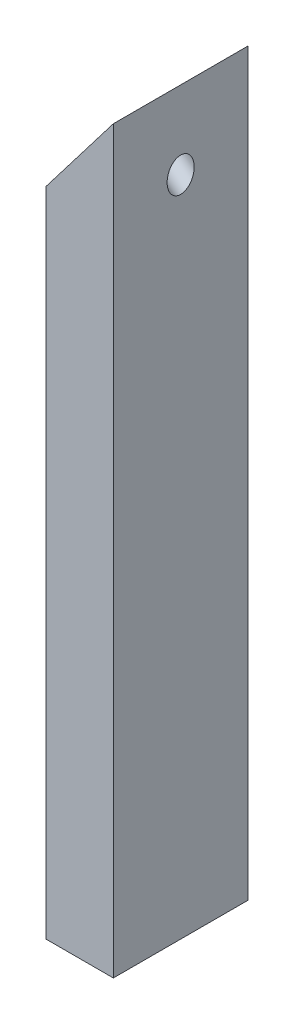
ISO-10303-21;
HEADER;
FILE_DESCRIPTION(('STEP AP214'),'2;1');
FILE_NAME('part.step','',(''),(''),'','','');
FILE_SCHEMA(('AUTOMOTIVE_DESIGN { 1 0 10303 214 1 1 1 1 }'));
ENDSEC;
DATA;
#1=APPLICATION_CONTEXT('core data for automotive mechanical design processes');
#2=APPLICATION_PROTOCOL_DEFINITION('international standard','automotive_design',2000,#1);
#3=PRODUCT_CONTEXT('',#1,'mechanical');
#4=PRODUCT('Part','Part','',(#3));
#5=PRODUCT_RELATED_PRODUCT_CATEGORY('part','',(#4));
#6=PRODUCT_DEFINITION_FORMATION('','',#4);
#7=PRODUCT_DEFINITION_CONTEXT('part definition',#1,'design');
#8=PRODUCT_DEFINITION('design','',#6,#7);
#9=PRODUCT_DEFINITION_SHAPE('','',#8);
#10=(LENGTH_UNIT() NAMED_UNIT(*) SI_UNIT(.MILLI.,.METRE.));
#11=(NAMED_UNIT(*) PLANE_ANGLE_UNIT() SI_UNIT($,.RADIAN.));
#12=(NAMED_UNIT(*) SI_UNIT($,.STERADIAN.) SOLID_ANGLE_UNIT());
#13=UNCERTAINTY_MEASURE_WITH_UNIT(LENGTH_MEASURE(1.E-05),#10,'distance_accuracy_value','');
#14=(GEOMETRIC_REPRESENTATION_CONTEXT(3) GLOBAL_UNCERTAINTY_ASSIGNED_CONTEXT((#13)) GLOBAL_UNIT_ASSIGNED_CONTEXT((#10,
#11,#12)) REPRESENTATION_CONTEXT('',''));
#15=CARTESIAN_POINT('',(0.,0.,0.));
#16=DIRECTION('',(0.,0.,1.));
#17=DIRECTION('',(1.,0.,0.));
#18=AXIS2_PLACEMENT_3D('',#15,#16,#17);
#19=CARTESIAN_POINT('',(-6.34999999994852,-71.0083768892483,25.4));
#20=DIRECTION('',(1.,0.,0.));
#21=DIRECTION('',(0.,1.,0.));
#22=AXIS2_PLACEMENT_3D('',#19,#20,#21);
#23=PLANE('',#22);
#24=DIRECTION('',(0.,-1.,0.));
#25=VECTOR('',#24,1.);
#26=CARTESIAN_POINT('',(-6.34999999994852,-71.0083768892483,0.));
#27=LINE('',#26,#25);
#28=CARTESIAN_POINT('',(-6.34999999994835,51.9879414662121,0.));
#29=VERTEX_POINT('',#28);
#30=CARTESIAN_POINT('',(-6.34999999994852,-71.0083768892483,0.));
#31=VERTEX_POINT('',#30);
#32=EDGE_CURVE('E105',#29,#31,#27,.T.);
#33=ORIENTED_EDGE('',*,*,#32,.T.);
#34=DIRECTION('',(0.,0.,-1.));
#35=VECTOR('',#34,1.);
#36=CARTESIAN_POINT('',(-6.34999999994852,-71.0083768892483,25.4));
#37=LINE('',#36,#35);
#38=CARTESIAN_POINT('',(-6.34999999994852,-71.0083768892483,25.4));
#39=VERTEX_POINT('',#38);
#40=EDGE_CURVE('E11',#39,#31,#37,.T.);
#41=ORIENTED_EDGE('',*,*,#40,.F.);
#42=DIRECTION('',(0.,-1.,0.));
#43=VECTOR('',#42,1.);
#44=CARTESIAN_POINT('',(-6.34999999994852,-71.0083768892483,25.4));
#45=LINE('',#44,#43);
#46=CARTESIAN_POINT('',(-6.34999999994835,51.9879414662121,25.4));
#47=VERTEX_POINT('',#46);
#48=EDGE_CURVE('E106',#47,#39,#45,.T.);
#49=ORIENTED_EDGE('',*,*,#48,.F.);
#50=DIRECTION('',(0.,0.,-1.));
#51=VECTOR('',#50,1.);
#52=CARTESIAN_POINT('',(-6.34999999994835,51.9879414662121,25.4));
#53=LINE('',#52,#51);
#54=EDGE_CURVE('E112',#47,#29,#53,.T.);
#55=ORIENTED_EDGE('',*,*,#54,.T.);
#56=EDGE_LOOP('',(#33,#41,#49,#55));
#57=FACE_BOUND('',#56,.T.);
#58=ADVANCED_FACE('F33',(#57),#23,.F.);
#59=CARTESIAN_POINT('',(6.35000000005149,-71.0083768892483,25.4));
#60=DIRECTION('',(0.,1.,0.));
#61=DIRECTION('',(0.,0.,1.));
#62=AXIS2_PLACEMENT_3D('',#59,#60,#61);
#63=PLANE('',#62);
#64=CARTESIAN_POINT('',(-0.131372318653275,-71.0083768892483,12.7));
#65=DIRECTION('',(0.,-1.,0.));
#66=DIRECTION('',(0.,0.,-1.));
#67=AXIS2_PLACEMENT_3D('',#64,#65,#66);
#68=CIRCLE('',#67,2.55269999999999);
#69=CARTESIAN_POINT('',(-0.131372318653275,-71.0083768892483,10.1473));
#70=VERTEX_POINT('',#69);
#71=EDGE_CURVE('E95',#70,#70,#68,.T.);
#72=ORIENTED_EDGE('',*,*,#71,.F.);
#73=EDGE_LOOP('',(#72));
#74=FACE_BOUND('',#73,.T.);
#75=DIRECTION('',(1.,0.,0.));
#76=VECTOR('',#75,1.);
#77=CARTESIAN_POINT('',(6.35000000005149,-71.0083768892483,0.));
#78=LINE('',#77,#76);
#79=CARTESIAN_POINT('',(6.35000000005149,-71.0083768892483,0.));
#80=VERTEX_POINT('',#79);
#81=EDGE_CURVE('E115',#31,#80,#78,.T.);
#82=ORIENTED_EDGE('',*,*,#81,.T.);
#83=DIRECTION('',(0.,0.,-1.));
#84=VECTOR('',#83,1.);
#85=CARTESIAN_POINT('',(6.35000000005149,-71.0083768892483,25.4));
#86=LINE('',#85,#84);
#87=CARTESIAN_POINT('',(6.35000000005149,-71.0083768892483,25.4));
#88=VERTEX_POINT('',#87);
#89=EDGE_CURVE('E41',#88,#80,#86,.T.);
#90=ORIENTED_EDGE('',*,*,#89,.F.);
#91=DIRECTION('',(1.,0.,0.));
#92=VECTOR('',#91,1.);
#93=CARTESIAN_POINT('',(6.35000000005149,-71.0083768892483,25.4));
#94=LINE('',#93,#92);
#95=EDGE_CURVE('E80',#39,#88,#94,.T.);
#96=ORIENTED_EDGE('',*,*,#95,.F.);
#97=ORIENTED_EDGE('',*,*,#40,.T.);
#98=EDGE_LOOP('',(#82,#90,#96,#97));
#99=FACE_BOUND('',#98,.T.);
#100=ADVANCED_FACE('F139',(#74,#99),#63,.F.);
#101=CARTESIAN_POINT('',(6.35000000005165,68.5808387469121,25.4));
#102=DIRECTION('',(-1.,0.,0.));
#103=DIRECTION('',(0.,-1.,0.));
#104=AXIS2_PLACEMENT_3D('',#101,#102,#103);
#105=PLANE('',#104);
#106=CARTESIAN_POINT('',(6.35000000005163,53.9001413605844,12.7));
#107=DIRECTION('',(-1.,0.,0.));
#108=DIRECTION('',(0.,1.,0.));
#109=AXIS2_PLACEMENT_3D('',#106,#107,#108);
#110=ELLIPSE('',#109,3.21459675346348,2.55269999999999);
#111=CARTESIAN_POINT('',(6.35000000005163,57.1147381140479,12.7));
#112=VERTEX_POINT('',#111);
#113=EDGE_CURVE('E98',#112,#112,#110,.T.);
#114=ORIENTED_EDGE('',*,*,#113,.T.);
#115=EDGE_LOOP('',(#114));
#116=FACE_BOUND('',#115,.T.);
#117=DIRECTION('',(0.,1.,0.));
#118=VECTOR('',#117,1.);
#119=CARTESIAN_POINT('',(6.35000000005165,68.5808387469121,0.));
#120=LINE('',#119,#118);
#121=CARTESIAN_POINT('',(6.35000000005165,68.5808387469121,0.));
#122=VERTEX_POINT('',#121);
#123=EDGE_CURVE('E67',#80,#122,#120,.T.);
#124=ORIENTED_EDGE('',*,*,#123,.T.);
#125=DIRECTION('',(0.,0.,-1.));
#126=VECTOR('',#125,1.);
#127=CARTESIAN_POINT('',(6.35000000005165,68.5808387469121,25.4));
#128=LINE('',#127,#126);
#129=CARTESIAN_POINT('',(6.35000000005165,68.5808387469121,25.4));
#130=VERTEX_POINT('',#129);
#131=EDGE_CURVE('E120',#130,#122,#128,.T.);
#132=ORIENTED_EDGE('',*,*,#131,.F.);
#133=DIRECTION('',(0.,1.,0.));
#134=VECTOR('',#133,1.);
#135=CARTESIAN_POINT('',(6.35000000005165,68.5808387469121,25.4));
#136=LINE('',#135,#134);
#137=EDGE_CURVE('E109',#88,#130,#136,.T.);
#138=ORIENTED_EDGE('',*,*,#137,.F.);
#139=ORIENTED_EDGE('',*,*,#89,.T.);
#140=EDGE_LOOP('',(#124,#132,#138,#139));
#141=FACE_BOUND('',#140,.T.);
#142=ADVANCED_FACE('F122',(#116,#141),#105,.F.);
#143=CARTESIAN_POINT('',(-6.34999999994835,51.9879414662121,25.4));
#144=DIRECTION('',(0.794096490407281,-0.607791710969177,0.));
#145=DIRECTION('',(0.607791710969177,0.794096490407281,0.));
#146=AXIS2_PLACEMENT_3D('',#143,#144,#145);
#147=PLANE('',#146);
#148=CARTESIAN_POINT('',(-0.735569074180508,59.3233489969877,12.7));
#149=DIRECTION('',(-0.794096490407281,0.607791710969177,0.));
#150=DIRECTION('',(-0.607791710969177,-0.794096490407281,0.));
#151=AXIS2_PLACEMENT_3D('',#148,#149,#150);
#152=CIRCLE('',#151,2.55269999999999);
#153=CARTESIAN_POINT('',(-2.28707897477152,57.2962588859251,12.7));
#154=VERTEX_POINT('',#153);
#155=EDGE_CURVE('E94',#154,#154,#152,.T.);
#156=ORIENTED_EDGE('',*,*,#155,.F.);
#157=EDGE_LOOP('',(#156));
#158=FACE_BOUND('',#157,.T.);
#159=DIRECTION('',(-0.607791710969177,-0.794096490407281,0.));
#160=VECTOR('',#159,1.);
#161=CARTESIAN_POINT('',(-6.34999999994835,51.9879414662121,0.));
#162=LINE('',#161,#160);
#163=EDGE_CURVE('E73',#122,#29,#162,.T.);
#164=ORIENTED_EDGE('',*,*,#163,.T.);
#165=ORIENTED_EDGE('',*,*,#54,.F.);
#166=DIRECTION('',(-0.607791710969177,-0.794096490407281,0.));
#167=VECTOR('',#166,1.);
#168=CARTESIAN_POINT('',(-6.34999999994835,51.9879414662121,25.4));
#169=LINE('',#168,#167);
#170=EDGE_CURVE('E49',#130,#47,#169,.T.);
#171=ORIENTED_EDGE('',*,*,#170,.F.);
#172=ORIENTED_EDGE('',*,*,#131,.T.);
#173=EDGE_LOOP('',(#164,#165,#171,#172));
#174=FACE_BOUND('',#173,.T.);
#175=ADVANCED_FACE('F129',(#158,#174),#147,.F.);
#176=CARTESIAN_POINT('',(-6.34999999994852,-71.0083768892483,25.4));
#177=DIRECTION('',(0.,0.,1.));
#178=DIRECTION('',(1.,0.,0.));
#179=AXIS2_PLACEMENT_3D('',#176,#177,#178);
#180=PLANE('',#179);
#181=ORIENTED_EDGE('',*,*,#48,.T.);
#182=ORIENTED_EDGE('',*,*,#95,.T.);
#183=ORIENTED_EDGE('',*,*,#137,.T.);
#184=ORIENTED_EDGE('',*,*,#170,.T.);
#185=EDGE_LOOP('',(#181,#182,#183,#184));
#186=FACE_BOUND('',#185,.T.);
#187=ADVANCED_FACE('F131',(#186),#180,.T.);
#188=CARTESIAN_POINT('',(-6.34999999994852,-71.0083768892483,0.));
#189=DIRECTION('',(0.,0.,1.));
#190=DIRECTION('',(1.,0.,0.));
#191=AXIS2_PLACEMENT_3D('',#188,#189,#190);
#192=PLANE('',#191);
#193=ORIENTED_EDGE('',*,*,#32,.F.);
#194=ORIENTED_EDGE('',*,*,#163,.F.);
#195=ORIENTED_EDGE('',*,*,#123,.F.);
#196=ORIENTED_EDGE('',*,*,#81,.F.);
#197=EDGE_LOOP('',(#193,#194,#195,#196));
#198=FACE_BOUND('',#197,.T.);
#199=ADVANCED_FACE('F125',(#198),#192,.F.);
#200=CARTESIAN_POINT('',(-0.735569074180507,59.3233489969877,12.7));
#201=DIRECTION('',(-0.794096490407281,0.607791710969177,0.));
#202=DIRECTION('',(-0.607791710969177,-0.794096490407281,0.));
#203=AXIS2_PLACEMENT_3D('',#200,#201,#202);
#204=CYLINDRICAL_SURFACE('',#203,2.55269999999999);
#205=ORIENTED_EDGE('',*,*,#155,.T.);
#206=EDGE_LOOP('',(#205));
#207=FACE_BOUND('',#206,.T.);
#208=ORIENTED_EDGE('',*,*,#113,.F.);
#209=EDGE_LOOP('',(#208));
#210=FACE_BOUND('',#209,.T.);
#211=ADVANCED_FACE('F88',(#207,#210),#204,.F.);
#212=CARTESIAN_POINT('',(-0.131372318653275,-55.0063768892483,12.7));
#213=DIRECTION('',(0.,-1.,0.));
#214=DIRECTION('',(0.,0.,-1.));
#215=AXIS2_PLACEMENT_3D('',#212,#213,#214);
#216=CONICAL_SURFACE('',#215,2.5527,1.02974425867665);
#217=CARTESIAN_POINT('',(-0.131372318653279,-53.4725599870566,12.7));
#218=VERTEX_POINT('',#217);
#219=VERTEX_LOOP('',#218);
#220=FACE_BOUND('',#219,.T.);
#221=CARTESIAN_POINT('',(-0.131372318653275,-55.0063768892483,12.7));
#222=DIRECTION('',(0.,-1.,0.));
#223=DIRECTION('',(0.,0.,-1.));
#224=AXIS2_PLACEMENT_3D('',#221,#222,#223);
#225=CIRCLE('',#224,2.5527);
#226=CARTESIAN_POINT('',(-0.131372318653275,-55.0063768892483,10.1473));
#227=VERTEX_POINT('',#226);
#228=EDGE_CURVE('E92',#227,#227,#225,.T.);
#229=ORIENTED_EDGE('',*,*,#228,.T.);
#230=EDGE_LOOP('',(#229));
#231=FACE_BOUND('',#230,.T.);
#232=ADVANCED_FACE('F84',(#220,#231),#216,.F.);
#233=CARTESIAN_POINT('',(-0.131372318653275,-71.0083768892483,12.7));
#234=DIRECTION('',(0.,-1.,0.));
#235=DIRECTION('',(0.,0.,-1.));
#236=AXIS2_PLACEMENT_3D('',#233,#234,#235);
#237=CYLINDRICAL_SURFACE('',#236,2.55269999999999);
#238=ORIENTED_EDGE('',*,*,#228,.F.);
#239=EDGE_LOOP('',(#238));
#240=FACE_BOUND('',#239,.T.);
#241=ORIENTED_EDGE('',*,*,#71,.T.);
#242=EDGE_LOOP('',(#241));
#243=FACE_BOUND('',#242,.T.);
#244=ADVANCED_FACE('F87',(#240,#243),#237,.F.);
#245=CLOSED_SHELL('',(#58,#100,#142,#175,#187,#199,#211,#232,#244));
#246=MANIFOLD_SOLID_BREP('B2',#245);
#247=ADVANCED_BREP_SHAPE_REPRESENTATION('',(#18,#246),#14);
#248=SHAPE_DEFINITION_REPRESENTATION(#9,#247);
ENDSEC;
END-ISO-10303-21;
